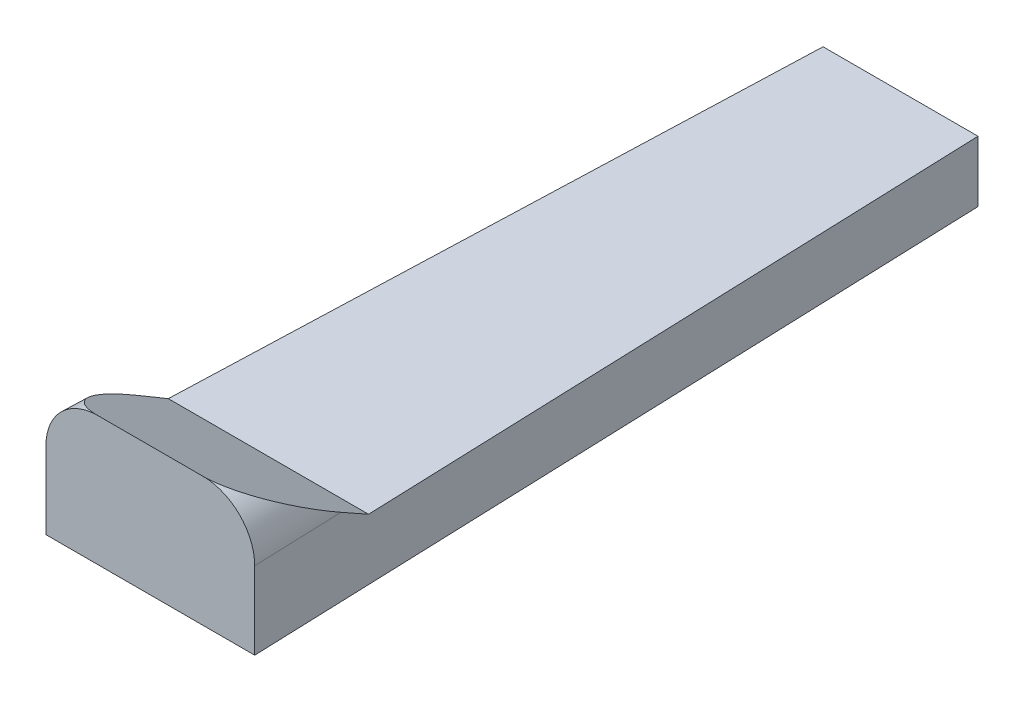
ISO-10303-21;
HEADER;
FILE_DESCRIPTION(('STEP AP214'),'2;1');
FILE_NAME('part.step','',(''),(''),'','','');
FILE_SCHEMA(('AUTOMOTIVE_DESIGN { 1 0 10303 214 1 1 1 1 }'));
ENDSEC;
DATA;
#1=APPLICATION_CONTEXT('core data for automotive mechanical design processes');
#2=APPLICATION_PROTOCOL_DEFINITION('international standard','automotive_design',2000,#1);
#3=PRODUCT_CONTEXT('',#1,'mechanical');
#4=PRODUCT('Part','Part','',(#3));
#5=PRODUCT_RELATED_PRODUCT_CATEGORY('part','',(#4));
#6=PRODUCT_DEFINITION_FORMATION('','',#4);
#7=PRODUCT_DEFINITION_CONTEXT('part definition',#1,'design');
#8=PRODUCT_DEFINITION('design','',#6,#7);
#9=PRODUCT_DEFINITION_SHAPE('','',#8);
#10=(LENGTH_UNIT() NAMED_UNIT(*) SI_UNIT(.MILLI.,.METRE.));
#11=(NAMED_UNIT(*) PLANE_ANGLE_UNIT() SI_UNIT($,.RADIAN.));
#12=(NAMED_UNIT(*) SI_UNIT($,.STERADIAN.) SOLID_ANGLE_UNIT());
#13=UNCERTAINTY_MEASURE_WITH_UNIT(LENGTH_MEASURE(1.E-05),#10,'distance_accuracy_value','');
#14=(GEOMETRIC_REPRESENTATION_CONTEXT(3) GLOBAL_UNCERTAINTY_ASSIGNED_CONTEXT((#13)) GLOBAL_UNIT_ASSIGNED_CONTEXT((#10,
#11,#12)) REPRESENTATION_CONTEXT('',''));
#15=CARTESIAN_POINT('',(0.,0.,0.));
#16=DIRECTION('',(0.,0.,1.));
#17=DIRECTION('',(1.,0.,0.));
#18=AXIS2_PLACEMENT_3D('',#15,#16,#17);
#19=CARTESIAN_POINT('',(0.,19.05,0.));
#20=DIRECTION('',(0.,1.,0.));
#21=DIRECTION('',(0.,0.,1.));
#22=AXIS2_PLACEMENT_3D('',#19,#20,#21);
#23=PLANE('',#22);
#24=DIRECTION('',(1.,0.,0.));
#25=VECTOR('',#24,1.);
#26=CARTESIAN_POINT('',(0.,19.05,-1266.4694));
#27=LINE('',#26,#25);
#28=CARTESIAN_POINT('',(-19.05,19.05,-1266.4694));
#29=VERTEX_POINT('',#28);
#30=CARTESIAN_POINT('',(19.05,19.05,-1266.4694));
#31=VERTEX_POINT('',#30);
#32=EDGE_CURVE('E11',#29,#31,#27,.T.);
#33=ORIENTED_EDGE('',*,*,#32,.T.);
#34=DIRECTION('',(-0.0358377664788086,0.,-0.999357620921465));
#35=VECTOR('',#34,1.);
#36=CARTESIAN_POINT('',(64.3838118894422,19.05,-2.30885517576965));
#37=LINE('',#36,#35);
#38=CARTESIAN_POINT('',(25.6657479035088,19.05,-1081.98530026192));
#39=VERTEX_POINT('',#38);
#40=EDGE_CURVE('E215',#39,#31,#37,.T.);
#41=ORIENTED_EDGE('',*,*,#40,.F.);
#42=DIRECTION('',(-1.,0.,0.));
#43=VECTOR('',#42,1.);
#44=CARTESIAN_POINT('',(0.,19.05,-1081.98530026192));
#45=LINE('',#44,#43);
#46=CARTESIAN_POINT('',(-25.6657479035088,19.05,-1081.98530026192));
#47=VERTEX_POINT('',#46);
#48=EDGE_CURVE('E54',#39,#47,#45,.T.);
#49=ORIENTED_EDGE('',*,*,#48,.T.);
#50=DIRECTION('',(-0.0358377664788086,0.,0.999357620921465));
#51=VECTOR('',#50,1.);
#52=CARTESIAN_POINT('',(-64.3838118894423,19.05,-2.30885517576966));
#53=LINE('',#52,#51);
#54=EDGE_CURVE('E61',#29,#47,#53,.T.);
#55=ORIENTED_EDGE('',*,*,#54,.F.);
#56=EDGE_LOOP('',(#33,#41,#49,#55));
#57=FACE_BOUND('',#56,.T.);
#58=ADVANCED_FACE('F45',(#57),#23,.F.);
#59=CARTESIAN_POINT('',(-37.9776687108685,38.1,-384.285238462535));
#60=DIRECTION('',(0.0358377664788086,0.,-0.999357620921465));
#61=DIRECTION('',(-0.999357620921465,0.,-0.0358377664788086));
#62=AXIS2_PLACEMENT_3D('',#59,#60,#61);
#63=CYLINDRICAL_SURFACE('',#62,12.7);
#64=DIRECTION('',(-0.0358377664788086,0.,0.999357620921465));
#65=VECTOR('',#64,1.);
#66=CARTESIAN_POINT('',(-19.05,38.1,-1266.4694));
#67=LINE('',#66,#65);
#68=CARTESIAN_POINT('',(-25.6657479035088,38.1,-1081.98530026192));
#69=VERTEX_POINT('',#68);
#70=CARTESIAN_POINT('',(-24.8769162034154,38.1,-1103.98234551804));
#71=VERTEX_POINT('',#70);
#72=EDGE_CURVE('E105',#69,#71,#67,.F.);
#73=ORIENTED_EDGE('',*,*,#72,.F.);
#74=CARTESIAN_POINT('',(-12.9575844451766,38.1,-1081.98530026192));
#75=DIRECTION('',(0.,0.,1.));
#76=DIRECTION('',(1.,0.,0.));
#77=AXIS2_PLACEMENT_3D('',#74,#75,#76);
#78=ELLIPSE('',#77,12.7081634583322,12.7);
#79=CARTESIAN_POINT('',(-12.9575844451766,50.8,-1081.98530026192));
#80=VERTEX_POINT('',#79);
#81=EDGE_CURVE('E108',#69,#80,#78,.F.);
#82=ORIENTED_EDGE('',*,*,#81,.T.);
#83=CARTESIAN_POINT('',(-12.1687527450831,38.1,-1103.98234551804));
#84=DIRECTION('',(0.,-0.866025403784437,0.500000000000002));
#85=DIRECTION('',(0.0413730329835587,-0.499571884752773,-0.865283886424741));
#86=AXIS2_PLACEMENT_3D('',#83,#84,#85);
#87=ELLIPSE('',#86,25.4163269166644,12.7);
#88=EDGE_CURVE('E110',#71,#80,#87,.F.);
#89=ORIENTED_EDGE('',*,*,#88,.F.);
#90=EDGE_LOOP('',(#73,#82,#89));
#91=FACE_BOUND('',#90,.T.);
#92=ADVANCED_FACE('F107',(#91),#63,.T.);
#93=CARTESIAN_POINT('',(51.6919701037396,38.1,-1.85371554148878));
#94=DIRECTION('',(-0.0358377664788086,0.,-0.999357620921465));
#95=DIRECTION('',(-0.999357620921465,0.,0.0358377664788086));
#96=AXIS2_PLACEMENT_3D('',#93,#94,#95);
#97=CYLINDRICAL_SURFACE('',#96,12.7);
#98=CARTESIAN_POINT('',(12.1687527450832,38.1,-1103.98234551804));
#99=DIRECTION('',(0.,-0.866025403784437,0.500000000000002));
#100=DIRECTION('',(-0.0413730329835587,-0.499571884752773,-0.865283886424741));
#101=AXIS2_PLACEMENT_3D('',#98,#99,#100);
#102=ELLIPSE('',#101,25.4163269166644,12.7);
#103=CARTESIAN_POINT('',(12.9575844451766,50.8,-1081.98530026192));
#104=VERTEX_POINT('',#103);
#105=CARTESIAN_POINT('',(24.8769162034154,38.1,-1103.98234551804));
#106=VERTEX_POINT('',#105);
#107=EDGE_CURVE('E138',#104,#106,#102,.F.);
#108=ORIENTED_EDGE('',*,*,#107,.F.);
#109=CARTESIAN_POINT('',(12.9575844451766,38.1,-1081.98530026192));
#110=DIRECTION('',(0.,0.,1.));
#111=DIRECTION('',(-1.,0.,0.));
#112=AXIS2_PLACEMENT_3D('',#109,#110,#111);
#113=ELLIPSE('',#112,12.7081634583322,12.7);
#114=CARTESIAN_POINT('',(25.6657479035088,38.1,-1081.98530026192));
#115=VERTEX_POINT('',#114);
#116=EDGE_CURVE('E122',#104,#115,#113,.F.);
#117=ORIENTED_EDGE('',*,*,#116,.T.);
#118=DIRECTION('',(0.0358377664788086,0.,0.999357620921465));
#119=VECTOR('',#118,1.);
#120=CARTESIAN_POINT('',(50.7999999999995,38.1,-381.101600000014));
#121=LINE('',#120,#119);
#122=EDGE_CURVE('E113',#106,#115,#121,.T.);
#123=ORIENTED_EDGE('',*,*,#122,.F.);
#124=EDGE_LOOP('',(#108,#117,#123));
#125=FACE_BOUND('',#124,.T.);
#126=ADVANCED_FACE('F162',(#125),#97,.T.);
#127=CARTESIAN_POINT('',(-177.8508,34.036,-1111.0214));
#128=DIRECTION('',(0.,-0.866025403784437,0.500000000000002));
#129=DIRECTION('',(0.,-0.500000000000002,-0.866025403784438));
#130=AXIS2_PLACEMENT_3D('',#127,#128,#129);
#131=PLANE('',#130);
#132=ORIENTED_EDGE('',*,*,#88,.T.);
#133=DIRECTION('',(1.,0.,0.));
#134=VECTOR('',#133,1.);
#135=CARTESIAN_POINT('',(-177.8508,50.8,-1081.98530026192));
#136=LINE('',#135,#134);
#137=EDGE_CURVE('E120',#80,#104,#136,.T.);
#138=ORIENTED_EDGE('',*,*,#137,.T.);
#139=ORIENTED_EDGE('',*,*,#107,.T.);
#140=DIRECTION('',(0.031041400070975,0.499759049813418,0.865608065819181));
#141=VECTOR('',#140,1.);
#142=CARTESIAN_POINT('',(53.9255511631451,505.776012443319,-293.943730485001));
#143=LINE('',#142,#141);
#144=CARTESIAN_POINT('',(24.6244900593855,34.0359999999999,-1111.0214));
#145=VERTEX_POINT('',#144);
#146=EDGE_CURVE('E205',#145,#106,#143,.T.);
#147=ORIENTED_EDGE('',*,*,#146,.F.);
#148=DIRECTION('',(1.,0.,0.));
#149=VECTOR('',#148,1.);
#150=CARTESIAN_POINT('',(-177.8508,34.036,-1111.0214));
#151=LINE('',#150,#149);
#152=CARTESIAN_POINT('',(-24.6244900593855,34.036,-1111.0214));
#153=VERTEX_POINT('',#152);
#154=EDGE_CURVE('E216',#153,#145,#151,.T.);
#155=ORIENTED_EDGE('',*,*,#154,.F.);
#156=DIRECTION('',(0.031041400070975,-0.499759049813418,-0.865608065819181));
#157=VECTOR('',#156,1.);
#158=CARTESIAN_POINT('',(-53.9255511631451,505.776012443319,-293.943730485001));
#159=LINE('',#158,#157);
#160=EDGE_CURVE('E222',#71,#153,#159,.T.);
#161=ORIENTED_EDGE('',*,*,#160,.F.);
#162=EDGE_LOOP('',(#132,#138,#139,#147,#155,#161));
#163=FACE_BOUND('',#162,.T.);
#164=ADVANCED_FACE('F158',(#163),#131,.F.);
#165=CARTESIAN_POINT('',(-177.8508,34.036,-1266.4694));
#166=DIRECTION('',(0.,-1.,0.));
#167=DIRECTION('',(0.,0.,-1.));
#168=AXIS2_PLACEMENT_3D('',#165,#166,#167);
#169=PLANE('',#168);
#170=DIRECTION('',(1.,0.,0.));
#171=VECTOR('',#170,1.);
#172=CARTESIAN_POINT('',(-177.8508,34.036,-1266.4694));
#173=LINE('',#172,#171);
#174=CARTESIAN_POINT('',(-19.05,34.036,-1266.4694));
#175=VERTEX_POINT('',#174);
#176=CARTESIAN_POINT('',(19.05,34.036,-1266.4694));
#177=VERTEX_POINT('',#176);
#178=EDGE_CURVE('E211',#175,#177,#173,.T.);
#179=ORIENTED_EDGE('',*,*,#178,.F.);
#180=DIRECTION('',(0.0358377664788086,0.,-0.999357620921465));
#181=VECTOR('',#180,1.);
#182=CARTESIAN_POINT('',(-64.3838118894423,34.0359999999998,-2.30885517576965));
#183=LINE('',#182,#181);
#184=EDGE_CURVE('E121',#153,#175,#183,.T.);
#185=ORIENTED_EDGE('',*,*,#184,.F.);
#186=ORIENTED_EDGE('',*,*,#154,.T.);
#187=DIRECTION('',(0.0358377664788086,0.,0.999357620921465));
#188=VECTOR('',#187,1.);
#189=CARTESIAN_POINT('',(64.3838118894422,34.0359999999998,-2.30885517576965));
#190=LINE('',#189,#188);
#191=EDGE_CURVE('E210',#177,#145,#190,.T.);
#192=ORIENTED_EDGE('',*,*,#191,.F.);
#193=EDGE_LOOP('',(#179,#185,#186,#192));
#194=FACE_BOUND('',#193,.T.);
#195=ADVANCED_FACE('F156',(#194),#169,.F.);
#196=CARTESIAN_POINT('',(0.,0.,-1266.4694));
#197=DIRECTION('',(0.,0.,-1.));
#198=DIRECTION('',(-1.,0.,0.));
#199=AXIS2_PLACEMENT_3D('',#196,#197,#198);
#200=PLANE('',#199);
#201=ORIENTED_EDGE('',*,*,#32,.F.);
#202=DIRECTION('',(0.,1.,0.));
#203=VECTOR('',#202,1.);
#204=CARTESIAN_POINT('',(-19.05,50.8,-1266.4694));
#205=LINE('',#204,#203);
#206=EDGE_CURVE('E225',#29,#175,#205,.T.);
#207=ORIENTED_EDGE('',*,*,#206,.T.);
#208=ORIENTED_EDGE('',*,*,#178,.T.);
#209=DIRECTION('',(0.,-1.,0.));
#210=VECTOR('',#209,1.);
#211=CARTESIAN_POINT('',(19.05,50.8,-1266.4694));
#212=LINE('',#211,#210);
#213=EDGE_CURVE('E48',#177,#31,#212,.T.);
#214=ORIENTED_EDGE('',*,*,#213,.T.);
#215=EDGE_LOOP('',(#201,#207,#208,#214));
#216=FACE_BOUND('',#215,.T.);
#217=ADVANCED_FACE('F147',(#216),#200,.T.);
#218=CARTESIAN_POINT('',(0.,0.,-1081.98530026192));
#219=DIRECTION('',(0.,0.,1.));
#220=DIRECTION('',(1.,0.,0.));
#221=AXIS2_PLACEMENT_3D('',#218,#219,#220);
#222=PLANE('',#221);
#223=ORIENTED_EDGE('',*,*,#48,.F.);
#224=DIRECTION('',(0.,1.,0.));
#225=VECTOR('',#224,1.);
#226=CARTESIAN_POINT('',(25.6657479035088,0.,-1081.98530026192));
#227=LINE('',#226,#225);
#228=EDGE_CURVE('E125',#39,#115,#227,.T.);
#229=ORIENTED_EDGE('',*,*,#228,.T.);
#230=ORIENTED_EDGE('',*,*,#116,.F.);
#231=ORIENTED_EDGE('',*,*,#137,.F.);
#232=ORIENTED_EDGE('',*,*,#81,.F.);
#233=DIRECTION('',(0.,-1.,0.));
#234=VECTOR('',#233,1.);
#235=CARTESIAN_POINT('',(-25.6657479035088,0.,-1081.98530026192));
#236=LINE('',#235,#234);
#237=EDGE_CURVE('E118',#69,#47,#236,.T.);
#238=ORIENTED_EDGE('',*,*,#237,.T.);
#239=EDGE_LOOP('',(#223,#229,#230,#231,#232,#238));
#240=FACE_BOUND('',#239,.T.);
#241=ADVANCED_FACE('F117',(#240),#222,.T.);
#242=CARTESIAN_POINT('',(64.3838118894422,0.,-2.30885517576965));
#243=DIRECTION('',(-0.999357620921465,0.,0.0358377664788086));
#244=DIRECTION('',(0.0358377664788086,0.,0.999357620921465));
#245=AXIS2_PLACEMENT_3D('',#242,#243,#244);
#246=PLANE('',#245);
#247=ORIENTED_EDGE('',*,*,#228,.F.);
#248=ORIENTED_EDGE('',*,*,#40,.T.);
#249=ORIENTED_EDGE('',*,*,#213,.F.);
#250=ORIENTED_EDGE('',*,*,#191,.T.);
#251=ORIENTED_EDGE('',*,*,#146,.T.);
#252=ORIENTED_EDGE('',*,*,#122,.T.);
#253=EDGE_LOOP('',(#247,#248,#249,#250,#251,#252));
#254=FACE_BOUND('',#253,.T.);
#255=ADVANCED_FACE('F169',(#254),#246,.F.);
#256=CARTESIAN_POINT('',(-64.3838118894423,0.,-2.30885517576966));
#257=DIRECTION('',(0.999357620921465,0.,0.0358377664788086));
#258=DIRECTION('',(0.0358377664788086,0.,-0.999357620921465));
#259=AXIS2_PLACEMENT_3D('',#256,#257,#258);
#260=PLANE('',#259);
#261=ORIENTED_EDGE('',*,*,#206,.F.);
#262=ORIENTED_EDGE('',*,*,#54,.T.);
#263=ORIENTED_EDGE('',*,*,#237,.F.);
#264=ORIENTED_EDGE('',*,*,#72,.T.);
#265=ORIENTED_EDGE('',*,*,#160,.T.);
#266=ORIENTED_EDGE('',*,*,#184,.T.);
#267=EDGE_LOOP('',(#261,#262,#263,#264,#265,#266));
#268=FACE_BOUND('',#267,.T.);
#269=ADVANCED_FACE('F124',(#268),#260,.F.);
#270=CLOSED_SHELL('',(#58,#92,#126,#164,#195,#217,#241,#255,#269));
#271=MANIFOLD_SOLID_BREP('B2',#270);
#272=ADVANCED_BREP_SHAPE_REPRESENTATION('',(#18,#271),#14);
#273=SHAPE_DEFINITION_REPRESENTATION(#9,#272);
ENDSEC;
END-ISO-10303-21;
